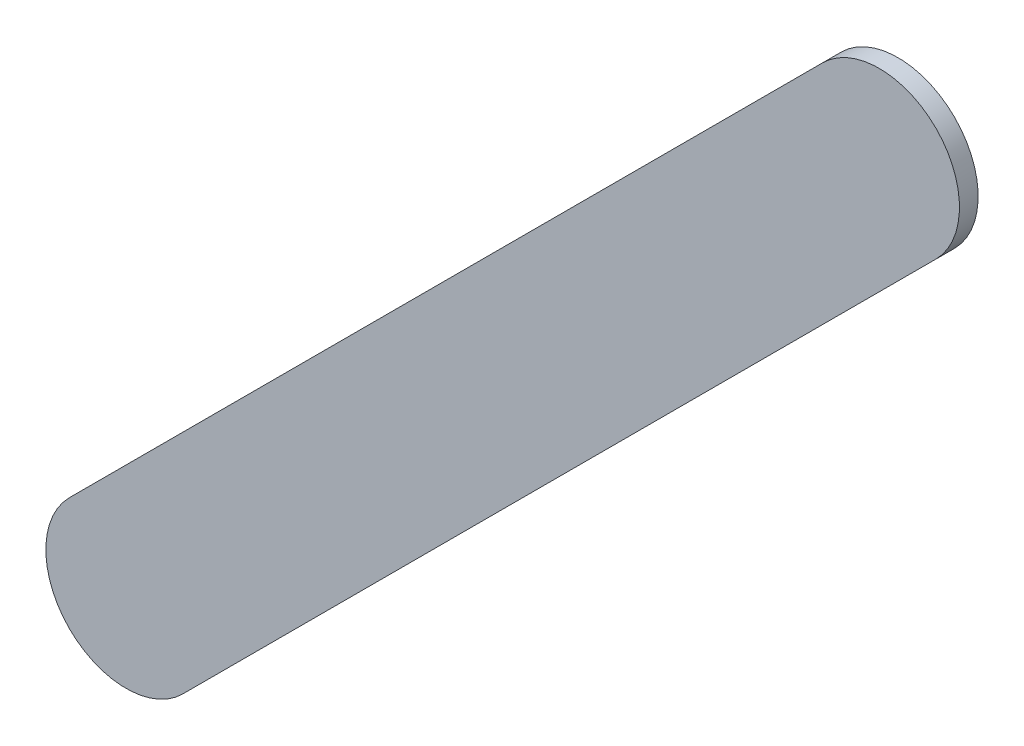
ISO-10303-21;
HEADER;
FILE_DESCRIPTION(('STEP AP214'),'2;1');
FILE_NAME('part.step','',(''),(''),'','','');
FILE_SCHEMA(('AUTOMOTIVE_DESIGN { 1 0 10303 214 1 1 1 1 }'));
ENDSEC;
DATA;
#1=APPLICATION_CONTEXT('core data for automotive mechanical design processes');
#2=APPLICATION_PROTOCOL_DEFINITION('international standard','automotive_design',2000,#1);
#3=PRODUCT_CONTEXT('',#1,'mechanical');
#4=PRODUCT('Part','Part','',(#3));
#5=PRODUCT_RELATED_PRODUCT_CATEGORY('part','',(#4));
#6=PRODUCT_DEFINITION_FORMATION('','',#4);
#7=PRODUCT_DEFINITION_CONTEXT('part definition',#1,'design');
#8=PRODUCT_DEFINITION('design','',#6,#7);
#9=PRODUCT_DEFINITION_SHAPE('','',#8);
#10=(LENGTH_UNIT() NAMED_UNIT(*) SI_UNIT(.MILLI.,.METRE.));
#11=(NAMED_UNIT(*) PLANE_ANGLE_UNIT() SI_UNIT($,.RADIAN.));
#12=(NAMED_UNIT(*) SI_UNIT($,.STERADIAN.) SOLID_ANGLE_UNIT());
#13=UNCERTAINTY_MEASURE_WITH_UNIT(LENGTH_MEASURE(1.E-05),#10,'distance_accuracy_value','');
#14=(GEOMETRIC_REPRESENTATION_CONTEXT(3) GLOBAL_UNCERTAINTY_ASSIGNED_CONTEXT((#13)) GLOBAL_UNIT_ASSIGNED_CONTEXT((#10,
#11,#12)) REPRESENTATION_CONTEXT('',''));
#15=CARTESIAN_POINT('',(0.,0.,0.));
#16=DIRECTION('',(0.,0.,1.));
#17=DIRECTION('',(1.,0.,0.));
#18=AXIS2_PLACEMENT_3D('',#15,#16,#17);
#19=CARTESIAN_POINT('',(94.996066,-137.116066,1.635));
#20=DIRECTION('',(0.,0.,1.));
#21=DIRECTION('',(1.,0.,0.));
#22=AXIS2_PLACEMENT_3D('',#19,#20,#21);
#23=PLANE('',#22);
#24=DIRECTION('',(0.707106781186548,0.707106781186548,0.));
#25=VECTOR('',#24,1.);
#26=CARTESIAN_POINT('',(94.996066,-137.116066,1.635));
#27=LINE('',#26,#25);
#28=CARTESIAN_POINT('',(94.996066,-137.116066,1.635));
#29=VERTEX_POINT('',#28);
#30=CARTESIAN_POINT('',(96.406066,-135.706066,1.635));
#31=VERTEX_POINT('',#30);
#32=EDGE_CURVE('E79',#29,#31,#27,.T.);
#33=ORIENTED_EDGE('',*,*,#32,.T.);
#34=CARTESIAN_POINT('',(96.2999995,-135.5999995,1.635));
#35=DIRECTION('',(0.,0.,1.));
#36=DIRECTION('',(0.707106781186548,-0.707106781186548,0.));
#37=AXIS2_PLACEMENT_3D('',#34,#35,#36);
#38=CIRCLE('',#37,0.150000682813);
#39=CARTESIAN_POINT('',(96.193933,-135.493933,1.635));
#40=VERTEX_POINT('',#39);
#41=EDGE_CURVE('E77',#31,#40,#38,.T.);
#42=ORIENTED_EDGE('',*,*,#41,.T.);
#43=DIRECTION('',(-0.707106781186548,-0.707106781186548,0.));
#44=VECTOR('',#43,1.);
#45=CARTESIAN_POINT('',(96.193933,-135.493933,1.635));
#46=LINE('',#45,#44);
#47=CARTESIAN_POINT('',(94.783933,-136.903933,1.635));
#48=VERTEX_POINT('',#47);
#49=EDGE_CURVE('E65',#40,#48,#46,.T.);
#50=ORIENTED_EDGE('',*,*,#49,.T.);
#51=CARTESIAN_POINT('',(94.8899995,-137.0099995,1.635));
#52=DIRECTION('',(0.,0.,1.));
#53=DIRECTION('',(-0.707106781186548,0.707106781186548,0.));
#54=AXIS2_PLACEMENT_3D('',#51,#52,#53);
#55=CIRCLE('',#54,0.150000682813);
#56=EDGE_CURVE('E11',#48,#29,#55,.T.);
#57=ORIENTED_EDGE('',*,*,#56,.T.);
#58=EDGE_LOOP('',(#33,#42,#50,#57));
#59=FACE_BOUND('',#58,.T.);
#60=ADVANCED_FACE('F17',(#59),#23,.T.);
#61=CARTESIAN_POINT('',(94.996066,-137.116066,1.6));
#62=DIRECTION('',(0.,0.,1.));
#63=DIRECTION('',(1.,0.,0.));
#64=AXIS2_PLACEMENT_3D('',#61,#62,#63);
#65=PLANE('',#64);
#66=CARTESIAN_POINT('',(94.8899995,-137.0099995,1.6));
#67=DIRECTION('',(0.,0.,1.));
#68=DIRECTION('',(-0.707106781186548,0.707106781186548,0.));
#69=AXIS2_PLACEMENT_3D('',#66,#67,#68);
#70=CIRCLE('',#69,0.150000682813);
#71=CARTESIAN_POINT('',(94.783933,-136.903933,1.6));
#72=VERTEX_POINT('',#71);
#73=CARTESIAN_POINT('',(94.996066,-137.116066,1.6));
#74=VERTEX_POINT('',#73);
#75=EDGE_CURVE('E26',#72,#74,#70,.T.);
#76=ORIENTED_EDGE('',*,*,#75,.F.);
#77=DIRECTION('',(-0.707106781186548,-0.707106781186548,0.));
#78=VECTOR('',#77,1.);
#79=CARTESIAN_POINT('',(96.193933,-135.493933,1.6));
#80=LINE('',#79,#78);
#81=CARTESIAN_POINT('',(96.193933,-135.493933,1.6));
#82=VERTEX_POINT('',#81);
#83=EDGE_CURVE('E84',#82,#72,#80,.T.);
#84=ORIENTED_EDGE('',*,*,#83,.F.);
#85=CARTESIAN_POINT('',(96.2999995,-135.5999995,1.6));
#86=DIRECTION('',(0.,0.,1.));
#87=DIRECTION('',(0.707106781186548,-0.707106781186548,0.));
#88=AXIS2_PLACEMENT_3D('',#85,#86,#87);
#89=CIRCLE('',#88,0.150000682813);
#90=CARTESIAN_POINT('',(96.406066,-135.706066,1.6));
#91=VERTEX_POINT('',#90);
#92=EDGE_CURVE('E87',#91,#82,#89,.T.);
#93=ORIENTED_EDGE('',*,*,#92,.F.);
#94=DIRECTION('',(0.707106781186548,0.707106781186548,0.));
#95=VECTOR('',#94,1.);
#96=CARTESIAN_POINT('',(94.996066,-137.116066,1.6));
#97=LINE('',#96,#95);
#98=EDGE_CURVE('E193',#74,#91,#97,.T.);
#99=ORIENTED_EDGE('',*,*,#98,.F.);
#100=EDGE_LOOP('',(#76,#84,#93,#99));
#101=FACE_BOUND('',#100,.T.);
#102=ADVANCED_FACE('F157',(#101),#65,.F.);
#103=CARTESIAN_POINT('',(94.8899995,-137.0099995,1.6));
#104=DIRECTION('',(0.,0.,-1.));
#105=DIRECTION('',(-0.707106781186548,0.707106781186548,0.));
#106=AXIS2_PLACEMENT_3D('',#103,#104,#105);
#107=CYLINDRICAL_SURFACE('',#106,0.150000682813);
#108=ORIENTED_EDGE('',*,*,#75,.T.);
#109=DIRECTION('',(0.,0.,1.));
#110=VECTOR('',#109,1.);
#111=CARTESIAN_POINT('',(94.996066,-137.116066,1.6));
#112=LINE('',#111,#110);
#113=EDGE_CURVE('E94',#74,#29,#112,.T.);
#114=ORIENTED_EDGE('',*,*,#113,.T.);
#115=ORIENTED_EDGE('',*,*,#56,.F.);
#116=DIRECTION('',(0.,0.,1.));
#117=VECTOR('',#116,1.);
#118=CARTESIAN_POINT('',(94.783933,-136.903933,1.6));
#119=LINE('',#118,#117);
#120=EDGE_CURVE('E72',#72,#48,#119,.T.);
#121=ORIENTED_EDGE('',*,*,#120,.F.);
#122=EDGE_LOOP('',(#108,#114,#115,#121));
#123=FACE_BOUND('',#122,.T.);
#124=ADVANCED_FACE('F148',(#123),#107,.T.);
#125=CARTESIAN_POINT('',(96.193933,-135.493933,1.6));
#126=DIRECTION('',(0.707106781186548,-0.707106781186548,0.));
#127=DIRECTION('',(0.,0.,-1.));
#128=AXIS2_PLACEMENT_3D('',#125,#126,#127);
#129=PLANE('',#128);
#130=ORIENTED_EDGE('',*,*,#83,.T.);
#131=ORIENTED_EDGE('',*,*,#120,.T.);
#132=ORIENTED_EDGE('',*,*,#49,.F.);
#133=DIRECTION('',(0.,0.,1.));
#134=VECTOR('',#133,1.);
#135=CARTESIAN_POINT('',(96.193933,-135.493933,1.6));
#136=LINE('',#135,#134);
#137=EDGE_CURVE('E70',#82,#40,#136,.T.);
#138=ORIENTED_EDGE('',*,*,#137,.F.);
#139=EDGE_LOOP('',(#130,#131,#132,#138));
#140=FACE_BOUND('',#139,.T.);
#141=ADVANCED_FACE('F68',(#140),#129,.F.);
#142=CARTESIAN_POINT('',(96.2999995,-135.5999995,1.6));
#143=DIRECTION('',(0.,0.,-1.));
#144=DIRECTION('',(0.707106781186548,-0.707106781186548,0.));
#145=AXIS2_PLACEMENT_3D('',#142,#143,#144);
#146=CYLINDRICAL_SURFACE('',#145,0.150000682813);
#147=ORIENTED_EDGE('',*,*,#92,.T.);
#148=ORIENTED_EDGE('',*,*,#137,.T.);
#149=ORIENTED_EDGE('',*,*,#41,.F.);
#150=DIRECTION('',(0.,0.,1.));
#151=VECTOR('',#150,1.);
#152=CARTESIAN_POINT('',(96.406066,-135.706066,1.6));
#153=LINE('',#152,#151);
#154=EDGE_CURVE('E200',#91,#31,#153,.T.);
#155=ORIENTED_EDGE('',*,*,#154,.F.);
#156=EDGE_LOOP('',(#147,#148,#149,#155));
#157=FACE_BOUND('',#156,.T.);
#158=ADVANCED_FACE('F86',(#157),#146,.T.);
#159=CARTESIAN_POINT('',(94.996066,-137.116066,1.6));
#160=DIRECTION('',(-0.707106781186548,0.707106781186548,0.));
#161=DIRECTION('',(0.,0.,1.));
#162=AXIS2_PLACEMENT_3D('',#159,#160,#161);
#163=PLANE('',#162);
#164=ORIENTED_EDGE('',*,*,#98,.T.);
#165=ORIENTED_EDGE('',*,*,#154,.T.);
#166=ORIENTED_EDGE('',*,*,#32,.F.);
#167=ORIENTED_EDGE('',*,*,#113,.F.);
#168=EDGE_LOOP('',(#164,#165,#166,#167));
#169=FACE_BOUND('',#168,.T.);
#170=ADVANCED_FACE('F125',(#169),#163,.F.);
#171=CLOSED_SHELL('',(#60,#102,#124,#141,#158,#170));
#172=MANIFOLD_SOLID_BREP('B1',#171);
#173=ADVANCED_BREP_SHAPE_REPRESENTATION('',(#18,#172),#14);
#174=SHAPE_DEFINITION_REPRESENTATION(#9,#173);
ENDSEC;
END-ISO-10303-21;
